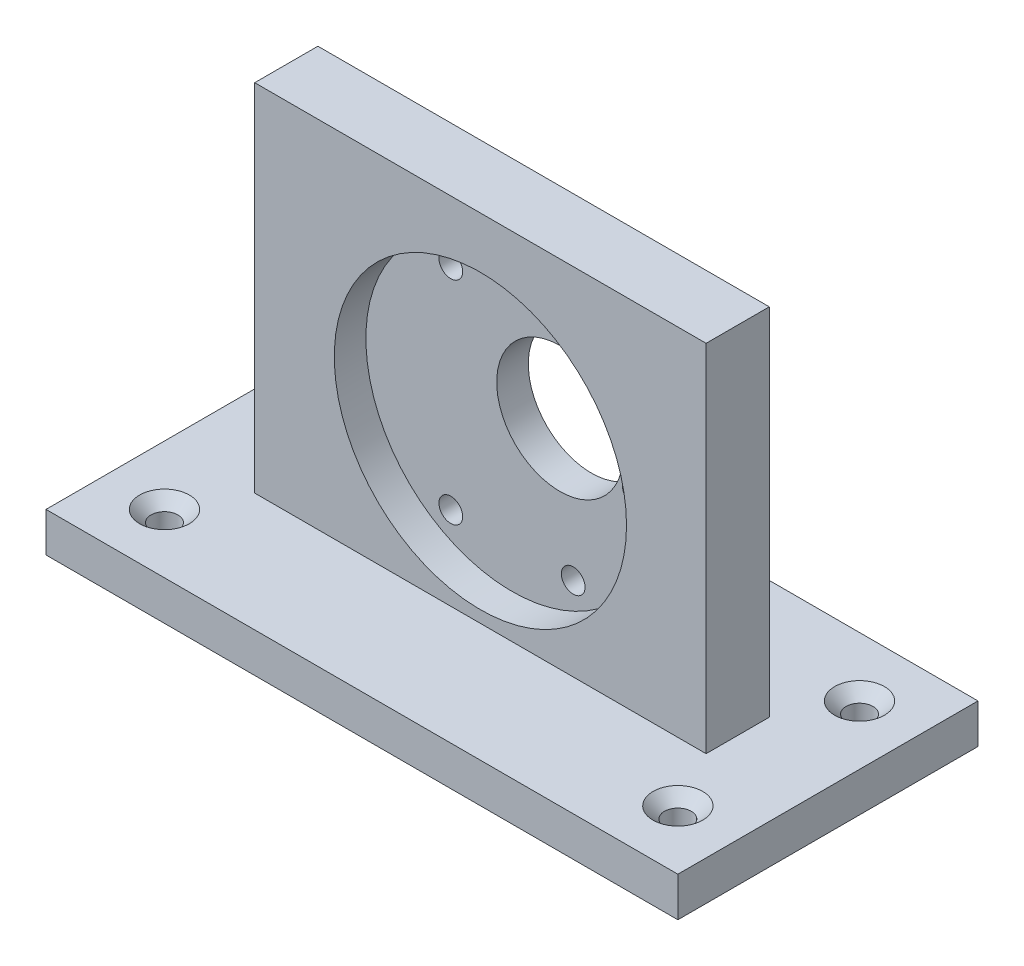
ISO-10303-21;
HEADER;
FILE_DESCRIPTION(('STEP AP214'),'2;1');
FILE_NAME('part.step','',(''),(''),'','','');
FILE_SCHEMA(('AUTOMOTIVE_DESIGN { 1 0 10303 214 1 1 1 1 }'));
ENDSEC;
DATA;
#1=APPLICATION_CONTEXT('core data for automotive mechanical design processes');
#2=APPLICATION_PROTOCOL_DEFINITION('international standard','automotive_design',2000,#1);
#3=PRODUCT_CONTEXT('',#1,'mechanical');
#4=PRODUCT('Part','Part','',(#3));
#5=PRODUCT_RELATED_PRODUCT_CATEGORY('part','',(#4));
#6=PRODUCT_DEFINITION_FORMATION('','',#4);
#7=PRODUCT_DEFINITION_CONTEXT('part definition',#1,'design');
#8=PRODUCT_DEFINITION('design','',#6,#7);
#9=PRODUCT_DEFINITION_SHAPE('','',#8);
#10=(LENGTH_UNIT() NAMED_UNIT(*) SI_UNIT(.MILLI.,.METRE.));
#11=(NAMED_UNIT(*) PLANE_ANGLE_UNIT() SI_UNIT($,.RADIAN.));
#12=(NAMED_UNIT(*) SI_UNIT($,.STERADIAN.) SOLID_ANGLE_UNIT());
#13=UNCERTAINTY_MEASURE_WITH_UNIT(LENGTH_MEASURE(1.E-05),#10,'distance_accuracy_value','');
#14=(GEOMETRIC_REPRESENTATION_CONTEXT(3) GLOBAL_UNCERTAINTY_ASSIGNED_CONTEXT((#13)) GLOBAL_UNIT_ASSIGNED_CONTEXT((#10,
#11,#12)) REPRESENTATION_CONTEXT('',''));
#15=CARTESIAN_POINT('',(0.,0.,0.));
#16=DIRECTION('',(0.,0.,1.));
#17=DIRECTION('',(1.,0.,0.));
#18=AXIS2_PLACEMENT_3D('',#15,#16,#17);
#19=CARTESIAN_POINT('',(-40.,5.,23.));
#20=DIRECTION('',(0.,-1.,0.));
#21=DIRECTION('',(1.,0.,0.));
#22=AXIS2_PLACEMENT_3D('',#19,#20,#21);
#23=PLANE('',#22);
#24=CARTESIAN_POINT('',(-32.5,5.,-7.5));
#25=DIRECTION('',(0.,1.,0.));
#26=DIRECTION('',(0.,0.,1.));
#27=AXIS2_PLACEMENT_3D('',#24,#25,#26);
#28=CIRCLE('',#27,3.15);
#29=CARTESIAN_POINT('',(-32.5,5.,-4.35));
#30=VERTEX_POINT('',#29);
#31=EDGE_CURVE('E156',#30,#30,#28,.T.);
#32=ORIENTED_EDGE('',*,*,#31,.F.);
#33=EDGE_LOOP('',(#32));
#34=FACE_BOUND('',#33,.T.);
#35=CARTESIAN_POINT('',(32.5,5.00000000000002,15.5));
#36=DIRECTION('',(0.,1.,0.));
#37=DIRECTION('',(0.,0.,1.));
#38=AXIS2_PLACEMENT_3D('',#35,#36,#37);
#39=CIRCLE('',#38,3.15);
#40=CARTESIAN_POINT('',(32.5,5.00000000000002,18.65));
#41=VERTEX_POINT('',#40);
#42=EDGE_CURVE('E166',#41,#41,#39,.T.);
#43=ORIENTED_EDGE('',*,*,#42,.F.);
#44=EDGE_LOOP('',(#43));
#45=FACE_BOUND('',#44,.T.);
#46=CARTESIAN_POINT('',(32.5,5.00000000000002,-7.5));
#47=DIRECTION('',(0.,1.,0.));
#48=DIRECTION('',(0.,0.,1.));
#49=AXIS2_PLACEMENT_3D('',#46,#47,#48);
#50=CIRCLE('',#49,3.15);
#51=CARTESIAN_POINT('',(32.5,5.00000000000002,-4.35));
#52=VERTEX_POINT('',#51);
#53=EDGE_CURVE('E178',#52,#52,#50,.T.);
#54=ORIENTED_EDGE('',*,*,#53,.F.);
#55=EDGE_LOOP('',(#54));
#56=FACE_BOUND('',#55,.T.);
#57=DIRECTION('',(0.,0.,-1.));
#58=VECTOR('',#57,1.);
#59=CARTESIAN_POINT('',(40.,5.00000000000002,23.));
#60=LINE('',#59,#58);
#61=CARTESIAN_POINT('',(40.,5.00000000000002,23.));
#62=VERTEX_POINT('',#61);
#63=CARTESIAN_POINT('',(40.,5.00000000000002,-15.));
#64=VERTEX_POINT('',#63);
#65=EDGE_CURVE('E222',#62,#64,#60,.T.);
#66=ORIENTED_EDGE('',*,*,#65,.T.);
#67=DIRECTION('',(-1.,0.,0.));
#68=VECTOR('',#67,1.);
#69=CARTESIAN_POINT('',(-40.,5.,-15.));
#70=LINE('',#69,#68);
#71=CARTESIAN_POINT('',(-40.,5.,-15.));
#72=VERTEX_POINT('',#71);
#73=EDGE_CURVE('E202',#64,#72,#70,.T.);
#74=ORIENTED_EDGE('',*,*,#73,.T.);
#75=DIRECTION('',(0.,0.,-1.));
#76=VECTOR('',#75,1.);
#77=CARTESIAN_POINT('',(-40.,5.,23.));
#78=LINE('',#77,#76);
#79=CARTESIAN_POINT('',(-40.,5.,23.));
#80=VERTEX_POINT('',#79);
#81=EDGE_CURVE('E219',#80,#72,#78,.T.);
#82=ORIENTED_EDGE('',*,*,#81,.F.);
#83=DIRECTION('',(-1.,0.,0.));
#84=VECTOR('',#83,1.);
#85=CARTESIAN_POINT('',(-40.,5.,23.));
#86=LINE('',#85,#84);
#87=EDGE_CURVE('E216',#62,#80,#86,.T.);
#88=ORIENTED_EDGE('',*,*,#87,.F.);
#89=EDGE_LOOP('',(#66,#74,#82,#88));
#90=FACE_BOUND('',#89,.T.);
#91=DIRECTION('',(0.,0.,-1.));
#92=VECTOR('',#91,1.);
#93=CARTESIAN_POINT('',(28.575,5.00000000000001,8.));
#94=LINE('',#93,#92);
#95=CARTESIAN_POINT('',(28.575,5.00000000000001,8.));
#96=VERTEX_POINT('',#95);
#97=CARTESIAN_POINT('',(28.575,5.00000000000001,0.));
#98=VERTEX_POINT('',#97);
#99=EDGE_CURVE('E231',#96,#98,#94,.T.);
#100=ORIENTED_EDGE('',*,*,#99,.F.);
#101=DIRECTION('',(-1.,0.,0.));
#102=VECTOR('',#101,1.);
#103=CARTESIAN_POINT('',(0.,5.00000000000001,8.));
#104=LINE('',#103,#102);
#105=CARTESIAN_POINT('',(-28.575,5.,8.));
#106=VERTEX_POINT('',#105);
#107=EDGE_CURVE('E238',#96,#106,#104,.T.);
#108=ORIENTED_EDGE('',*,*,#107,.T.);
#109=DIRECTION('',(0.,0.,-1.));
#110=VECTOR('',#109,1.);
#111=CARTESIAN_POINT('',(-28.575,5.,8.));
#112=LINE('',#111,#110);
#113=CARTESIAN_POINT('',(-28.575,5.,0.));
#114=VERTEX_POINT('',#113);
#115=EDGE_CURVE('E235',#106,#114,#112,.T.);
#116=ORIENTED_EDGE('',*,*,#115,.T.);
#117=DIRECTION('',(-1.,0.,0.));
#118=VECTOR('',#117,1.);
#119=CARTESIAN_POINT('',(0.,5.00000000000001,0.));
#120=LINE('',#119,#118);
#121=EDGE_CURVE('E60',#98,#114,#120,.T.);
#122=ORIENTED_EDGE('',*,*,#121,.F.);
#123=EDGE_LOOP('',(#100,#108,#116,#122));
#124=FACE_BOUND('',#123,.T.);
#125=CARTESIAN_POINT('',(-32.5,5.,15.5));
#126=DIRECTION('',(0.,1.,0.));
#127=DIRECTION('',(0.,0.,1.));
#128=AXIS2_PLACEMENT_3D('',#125,#126,#127);
#129=CIRCLE('',#128,3.15);
#130=CARTESIAN_POINT('',(-32.5,5.,18.65));
#131=VERTEX_POINT('',#130);
#132=EDGE_CURVE('E147',#131,#131,#129,.T.);
#133=ORIENTED_EDGE('',*,*,#132,.F.);
#134=EDGE_LOOP('',(#133));
#135=FACE_BOUND('',#134,.T.);
#136=ADVANCED_FACE('F51',(#34,#45,#56,#90,#124,#135),#23,.F.);
#137=CARTESIAN_POINT('',(-28.575,50.,8.));
#138=DIRECTION('',(1.,0.,0.));
#139=DIRECTION('',(0.,1.,0.));
#140=AXIS2_PLACEMENT_3D('',#137,#138,#139);
#141=PLANE('',#140);
#142=ORIENTED_EDGE('',*,*,#115,.F.);
#143=DIRECTION('',(0.,-1.,0.));
#144=VECTOR('',#143,1.);
#145=CARTESIAN_POINT('',(-28.575,50.,8.));
#146=LINE('',#145,#144);
#147=CARTESIAN_POINT('',(-28.575,50.,8.));
#148=VERTEX_POINT('',#147);
#149=EDGE_CURVE('E304',#148,#106,#146,.T.);
#150=ORIENTED_EDGE('',*,*,#149,.F.);
#151=DIRECTION('',(0.,0.,-1.));
#152=VECTOR('',#151,1.);
#153=CARTESIAN_POINT('',(-28.575,50.,8.));
#154=LINE('',#153,#152);
#155=CARTESIAN_POINT('',(-28.575,50.,0.));
#156=VERTEX_POINT('',#155);
#157=EDGE_CURVE('E319',#148,#156,#154,.T.);
#158=ORIENTED_EDGE('',*,*,#157,.T.);
#159=DIRECTION('',(0.,-1.,0.));
#160=VECTOR('',#159,1.);
#161=CARTESIAN_POINT('',(-28.575,50.,0.));
#162=LINE('',#161,#160);
#163=EDGE_CURVE('E300',#156,#114,#162,.T.);
#164=ORIENTED_EDGE('',*,*,#163,.T.);
#165=EDGE_LOOP('',(#142,#150,#158,#164));
#166=FACE_BOUND('',#165,.T.);
#167=ADVANCED_FACE('F336',(#166),#141,.F.);
#168=CARTESIAN_POINT('',(28.575,50.,8.));
#169=DIRECTION('',(1.,0.,0.));
#170=DIRECTION('',(0.,1.,0.));
#171=AXIS2_PLACEMENT_3D('',#168,#169,#170);
#172=PLANE('',#171);
#173=DIRECTION('',(0.,-1.,0.));
#174=VECTOR('',#173,1.);
#175=CARTESIAN_POINT('',(28.575,50.,8.));
#176=LINE('',#175,#174);
#177=CARTESIAN_POINT('',(28.575,50.,8.));
#178=VERTEX_POINT('',#177);
#179=EDGE_CURVE('E299',#178,#96,#176,.T.);
#180=ORIENTED_EDGE('',*,*,#179,.T.);
#181=ORIENTED_EDGE('',*,*,#99,.T.);
#182=DIRECTION('',(0.,-1.,0.));
#183=VECTOR('',#182,1.);
#184=CARTESIAN_POINT('',(28.575,50.,0.));
#185=LINE('',#184,#183);
#186=CARTESIAN_POINT('',(28.575,50.,0.));
#187=VERTEX_POINT('',#186);
#188=EDGE_CURVE('E312',#187,#98,#185,.T.);
#189=ORIENTED_EDGE('',*,*,#188,.F.);
#190=DIRECTION('',(0.,0.,-1.));
#191=VECTOR('',#190,1.);
#192=CARTESIAN_POINT('',(28.575,50.,8.));
#193=LINE('',#192,#191);
#194=EDGE_CURVE('E308',#178,#187,#193,.T.);
#195=ORIENTED_EDGE('',*,*,#194,.F.);
#196=EDGE_LOOP('',(#180,#181,#189,#195));
#197=FACE_BOUND('',#196,.T.);
#198=ADVANCED_FACE('F342',(#197),#172,.T.);
#199=CARTESIAN_POINT('',(0.,0.,8.));
#200=DIRECTION('',(0.,0.,-1.));
#201=DIRECTION('',(-1.,0.,0.));
#202=AXIS2_PLACEMENT_3D('',#199,#200,#201);
#203=PLANE('',#202);
#204=CARTESIAN_POINT('',(0.,25.,8.));
#205=DIRECTION('',(0.,0.,1.));
#206=DIRECTION('',(1.,0.,0.));
#207=AXIS2_PLACEMENT_3D('',#204,#205,#206);
#208=CIRCLE('',#207,18.5);
#209=CARTESIAN_POINT('',(18.5,25.,8.));
#210=VERTEX_POINT('',#209);
#211=EDGE_CURVE('E241',#210,#210,#208,.T.);
#212=ORIENTED_EDGE('',*,*,#211,.F.);
#213=EDGE_LOOP('',(#212));
#214=FACE_BOUND('',#213,.T.);
#215=ORIENTED_EDGE('',*,*,#107,.F.);
#216=ORIENTED_EDGE('',*,*,#179,.F.);
#217=DIRECTION('',(1.,0.,0.));
#218=VECTOR('',#217,1.);
#219=CARTESIAN_POINT('',(-28.575,50.,8.));
#220=LINE('',#219,#218);
#221=EDGE_CURVE('E295',#148,#178,#220,.T.);
#222=ORIENTED_EDGE('',*,*,#221,.F.);
#223=ORIENTED_EDGE('',*,*,#149,.T.);
#224=EDGE_LOOP('',(#215,#216,#222,#223));
#225=FACE_BOUND('',#224,.T.);
#226=ADVANCED_FACE('F346',(#214,#225),#203,.F.);
#227=CARTESIAN_POINT('',(0.,0.,0.));
#228=DIRECTION('',(0.,0.,-1.));
#229=DIRECTION('',(-1.,0.,0.));
#230=AXIS2_PLACEMENT_3D('',#227,#228,#229);
#231=PLANE('',#230);
#232=CARTESIAN_POINT('',(-20.3378221746704,28.4999999993294,0.));
#233=DIRECTION('',(0.,0.,-1.));
#234=DIRECTION('',(-1.,0.,0.));
#235=AXIS2_PLACEMENT_3D('',#232,#233,#234);
#236=CIRCLE('',#235,7.239);
#237=CARTESIAN_POINT('',(-27.5768221746704,28.4999999993294,0.));
#238=VERTEX_POINT('',#237);
#239=EDGE_CURVE('E763',#238,#238,#236,.T.);
#240=ORIENTED_EDGE('',*,*,#239,.F.);
#241=EDGE_LOOP('',(#240));
#242=FACE_BOUND('',#241,.T.);
#243=CARTESIAN_POINT('',(-7.74999999999999,38.4233937586588,0.));
#244=DIRECTION('',(0.,0.,1.));
#245=DIRECTION('',(1.,0.,0.));
#246=AXIS2_PLACEMENT_3D('',#243,#244,#245);
#247=CIRCLE('',#246,1.50000000039213);
#248=CARTESIAN_POINT('',(-6.24999999960786,38.4233937586588,0.));
#249=VERTEX_POINT('',#248);
#250=EDGE_CURVE('E275',#249,#249,#247,.T.);
#251=ORIENTED_EDGE('',*,*,#250,.T.);
#252=EDGE_LOOP('',(#251));
#253=FACE_BOUND('',#252,.T.);
#254=CARTESIAN_POINT('',(-7.74999999999999,11.5766062413412,0.));
#255=DIRECTION('',(0.,0.,1.));
#256=DIRECTION('',(1.,0.,0.));
#257=AXIS2_PLACEMENT_3D('',#254,#255,#256);
#258=CIRCLE('',#257,1.50000000039213);
#259=CARTESIAN_POINT('',(-6.24999999960786,11.5766062413412,0.));
#260=VERTEX_POINT('',#259);
#261=EDGE_CURVE('E280',#260,#260,#258,.T.);
#262=ORIENTED_EDGE('',*,*,#261,.T.);
#263=EDGE_LOOP('',(#262));
#264=FACE_BOUND('',#263,.T.);
#265=CARTESIAN_POINT('',(7.75000000000001,11.5766062413412,0.));
#266=DIRECTION('',(0.,0.,1.));
#267=DIRECTION('',(1.,0.,0.));
#268=AXIS2_PLACEMENT_3D('',#265,#266,#267);
#269=CIRCLE('',#268,1.50000000039213);
#270=CARTESIAN_POINT('',(9.25000000039214,11.5766062413412,0.));
#271=VERTEX_POINT('',#270);
#272=EDGE_CURVE('E284',#271,#271,#269,.T.);
#273=ORIENTED_EDGE('',*,*,#272,.T.);
#274=EDGE_LOOP('',(#273));
#275=FACE_BOUND('',#274,.T.);
#276=CARTESIAN_POINT('',(15.5,25.,0.));
#277=DIRECTION('',(0.,0.,1.));
#278=DIRECTION('',(1.,0.,0.));
#279=AXIS2_PLACEMENT_3D('',#276,#277,#278);
#280=CIRCLE('',#279,1.50000000039213);
#281=CARTESIAN_POINT('',(17.0000000003921,25.,0.));
#282=VERTEX_POINT('',#281);
#283=EDGE_CURVE('E274',#282,#282,#280,.T.);
#284=ORIENTED_EDGE('',*,*,#283,.T.);
#285=EDGE_LOOP('',(#284));
#286=FACE_BOUND('',#285,.T.);
#287=CARTESIAN_POINT('',(6.06217782532956,28.4999999993294,0.));
#288=DIRECTION('',(0.,0.,1.));
#289=DIRECTION('',(1.,0.,0.));
#290=AXIS2_PLACEMENT_3D('',#287,#288,#289);
#291=CIRCLE('',#290,8.00000000000001);
#292=CARTESIAN_POINT('',(14.0621778253296,28.4999999993294,0.));
#293=VERTEX_POINT('',#292);
#294=EDGE_CURVE('E270',#293,#293,#291,.T.);
#295=ORIENTED_EDGE('',*,*,#294,.T.);
#296=EDGE_LOOP('',(#295));
#297=FACE_BOUND('',#296,.T.);
#298=CARTESIAN_POINT('',(7.74999999999999,38.4233937586588,0.));
#299=DIRECTION('',(0.,0.,1.));
#300=DIRECTION('',(1.,0.,0.));
#301=AXIS2_PLACEMENT_3D('',#298,#299,#300);
#302=CIRCLE('',#301,1.50000000039214);
#303=CARTESIAN_POINT('',(9.25000000039213,38.4233937586588,0.));
#304=VERTEX_POINT('',#303);
#305=EDGE_CURVE('E279',#304,#304,#302,.T.);
#306=ORIENTED_EDGE('',*,*,#305,.T.);
#307=EDGE_LOOP('',(#306));
#308=FACE_BOUND('',#307,.T.);
#309=ORIENTED_EDGE('',*,*,#188,.T.);
#310=ORIENTED_EDGE('',*,*,#121,.T.);
#311=ORIENTED_EDGE('',*,*,#163,.F.);
#312=DIRECTION('',(1.,0.,0.));
#313=VECTOR('',#312,1.);
#314=CARTESIAN_POINT('',(-28.575,50.,0.));
#315=LINE('',#314,#313);
#316=EDGE_CURVE('E294',#156,#187,#315,.T.);
#317=ORIENTED_EDGE('',*,*,#316,.T.);
#318=EDGE_LOOP('',(#309,#310,#311,#317));
#319=FACE_BOUND('',#318,.T.);
#320=ADVANCED_FACE('F330',(#242,#253,#264,#275,#286,#297,#308,#319),#231,.T.);
#321=CARTESIAN_POINT('',(7.74999999999999,38.4233937586588,10.));
#322=DIRECTION('',(0.,0.,-1.));
#323=DIRECTION('',(-1.,0.,0.));
#324=AXIS2_PLACEMENT_3D('',#321,#322,#323);
#325=CYLINDRICAL_SURFACE('',#324,1.50000000039214);
#326=ORIENTED_EDGE('',*,*,#305,.F.);
#327=EDGE_LOOP('',(#326));
#328=FACE_BOUND('',#327,.T.);
#329=CARTESIAN_POINT('',(7.74999999999999,38.4233937586588,4.));
#330=DIRECTION('',(0.,0.,1.));
#331=DIRECTION('',(1.,0.,0.));
#332=AXIS2_PLACEMENT_3D('',#329,#330,#331);
#333=CIRCLE('',#332,1.50000000039214);
#334=CARTESIAN_POINT('',(9.25000000039213,38.4233937586588,4.));
#335=VERTEX_POINT('',#334);
#336=EDGE_CURVE('E266',#335,#335,#333,.T.);
#337=ORIENTED_EDGE('',*,*,#336,.T.);
#338=EDGE_LOOP('',(#337));
#339=FACE_BOUND('',#338,.T.);
#340=ADVANCED_FACE('F354',(#328,#339),#325,.F.);
#341=CARTESIAN_POINT('',(6.06217782532956,28.4999999993294,10.));
#342=DIRECTION('',(0.,0.,-1.));
#343=DIRECTION('',(-1.,0.,0.));
#344=AXIS2_PLACEMENT_3D('',#341,#342,#343);
#345=CYLINDRICAL_SURFACE('',#344,8.00000000000001);
#346=ORIENTED_EDGE('',*,*,#294,.F.);
#347=EDGE_LOOP('',(#346));
#348=FACE_BOUND('',#347,.T.);
#349=CARTESIAN_POINT('',(6.06217782532956,28.4999999993294,4.));
#350=DIRECTION('',(0.,0.,1.));
#351=DIRECTION('',(1.,0.,0.));
#352=AXIS2_PLACEMENT_3D('',#349,#350,#351);
#353=CIRCLE('',#352,8.00000000000001);
#354=CARTESIAN_POINT('',(14.0621778253296,28.4999999993294,4.));
#355=VERTEX_POINT('',#354);
#356=EDGE_CURVE('E262',#355,#355,#353,.T.);
#357=ORIENTED_EDGE('',*,*,#356,.T.);
#358=EDGE_LOOP('',(#357));
#359=FACE_BOUND('',#358,.T.);
#360=ADVANCED_FACE('F388',(#348,#359),#345,.F.);
#361=CARTESIAN_POINT('',(15.5,25.,10.));
#362=DIRECTION('',(0.,0.,-1.));
#363=DIRECTION('',(-1.,0.,0.));
#364=AXIS2_PLACEMENT_3D('',#361,#362,#363);
#365=CYLINDRICAL_SURFACE('',#364,1.50000000039213);
#366=ORIENTED_EDGE('',*,*,#283,.F.);
#367=EDGE_LOOP('',(#366));
#368=FACE_BOUND('',#367,.T.);
#369=CARTESIAN_POINT('',(15.5,25.,4.));
#370=DIRECTION('',(0.,0.,1.));
#371=DIRECTION('',(1.,0.,0.));
#372=AXIS2_PLACEMENT_3D('',#369,#370,#371);
#373=CIRCLE('',#372,1.50000000039213);
#374=CARTESIAN_POINT('',(17.0000000003921,25.,4.));
#375=VERTEX_POINT('',#374);
#376=EDGE_CURVE('E258',#375,#375,#373,.T.);
#377=ORIENTED_EDGE('',*,*,#376,.T.);
#378=EDGE_LOOP('',(#377));
#379=FACE_BOUND('',#378,.T.);
#380=ADVANCED_FACE('F391',(#368,#379),#365,.F.);
#381=CARTESIAN_POINT('',(7.75000000000001,11.5766062413412,10.));
#382=DIRECTION('',(0.,0.,-1.));
#383=DIRECTION('',(-1.,0.,0.));
#384=AXIS2_PLACEMENT_3D('',#381,#382,#383);
#385=CYLINDRICAL_SURFACE('',#384,1.50000000039213);
#386=ORIENTED_EDGE('',*,*,#272,.F.);
#387=EDGE_LOOP('',(#386));
#388=FACE_BOUND('',#387,.T.);
#389=CARTESIAN_POINT('',(7.75000000000001,11.5766062413412,4.));
#390=DIRECTION('',(0.,0.,1.));
#391=DIRECTION('',(1.,0.,0.));
#392=AXIS2_PLACEMENT_3D('',#389,#390,#391);
#393=CIRCLE('',#392,1.50000000039213);
#394=CARTESIAN_POINT('',(9.25000000039214,11.5766062413412,4.));
#395=VERTEX_POINT('',#394);
#396=EDGE_CURVE('E254',#395,#395,#393,.T.);
#397=ORIENTED_EDGE('',*,*,#396,.T.);
#398=EDGE_LOOP('',(#397));
#399=FACE_BOUND('',#398,.T.);
#400=ADVANCED_FACE('F400',(#388,#399),#385,.F.);
#401=CARTESIAN_POINT('',(-7.74999999999999,11.5766062413412,10.));
#402=DIRECTION('',(0.,0.,-1.));
#403=DIRECTION('',(-1.,0.,0.));
#404=AXIS2_PLACEMENT_3D('',#401,#402,#403);
#405=CYLINDRICAL_SURFACE('',#404,1.50000000039213);
#406=ORIENTED_EDGE('',*,*,#261,.F.);
#407=EDGE_LOOP('',(#406));
#408=FACE_BOUND('',#407,.T.);
#409=CARTESIAN_POINT('',(-7.74999999999999,11.5766062413412,4.));
#410=DIRECTION('',(0.,0.,1.));
#411=DIRECTION('',(1.,0.,0.));
#412=AXIS2_PLACEMENT_3D('',#409,#410,#411);
#413=CIRCLE('',#412,1.50000000039213);
#414=CARTESIAN_POINT('',(-6.24999999960786,11.5766062413412,4.));
#415=VERTEX_POINT('',#414);
#416=EDGE_CURVE('E250',#415,#415,#413,.T.);
#417=ORIENTED_EDGE('',*,*,#416,.T.);
#418=EDGE_LOOP('',(#417));
#419=FACE_BOUND('',#418,.T.);
#420=ADVANCED_FACE('F396',(#408,#419),#405,.F.);
#421=CARTESIAN_POINT('',(-7.74999999999999,38.4233937586588,10.));
#422=DIRECTION('',(0.,0.,-1.));
#423=DIRECTION('',(-1.,0.,0.));
#424=AXIS2_PLACEMENT_3D('',#421,#422,#423);
#425=CYLINDRICAL_SURFACE('',#424,1.50000000039213);
#426=ORIENTED_EDGE('',*,*,#250,.F.);
#427=EDGE_LOOP('',(#426));
#428=FACE_BOUND('',#427,.T.);
#429=CARTESIAN_POINT('',(-7.74999999999999,38.4233937586588,4.));
#430=DIRECTION('',(0.,0.,1.));
#431=DIRECTION('',(1.,0.,0.));
#432=AXIS2_PLACEMENT_3D('',#429,#430,#431);
#433=CIRCLE('',#432,1.50000000039213);
#434=CARTESIAN_POINT('',(-6.24999999960786,38.4233937586588,4.));
#435=VERTEX_POINT('',#434);
#436=EDGE_CURVE('E246',#435,#435,#433,.T.);
#437=ORIENTED_EDGE('',*,*,#436,.T.);
#438=EDGE_LOOP('',(#437));
#439=FACE_BOUND('',#438,.T.);
#440=ADVANCED_FACE('F393',(#428,#439),#425,.F.);
#441=CARTESIAN_POINT('',(-28.575,50.,8.));
#442=DIRECTION('',(0.,1.,0.));
#443=DIRECTION('',(-1.,0.,0.));
#444=AXIS2_PLACEMENT_3D('',#441,#442,#443);
#445=PLANE('',#444);
#446=ORIENTED_EDGE('',*,*,#316,.F.);
#447=ORIENTED_EDGE('',*,*,#157,.F.);
#448=ORIENTED_EDGE('',*,*,#221,.T.);
#449=ORIENTED_EDGE('',*,*,#194,.T.);
#450=EDGE_LOOP('',(#446,#447,#448,#449));
#451=FACE_BOUND('',#450,.T.);
#452=ADVANCED_FACE('F53',(#451),#445,.T.);
#453=CARTESIAN_POINT('',(0.,25.,4.));
#454=DIRECTION('',(0.,0.,1.));
#455=DIRECTION('',(1.,0.,0.));
#456=AXIS2_PLACEMENT_3D('',#453,#454,#455);
#457=CYLINDRICAL_SURFACE('',#456,18.5);
#458=CARTESIAN_POINT('',(0.,25.,4.));
#459=DIRECTION('',(0.,0.,1.));
#460=DIRECTION('',(1.,0.,0.));
#461=AXIS2_PLACEMENT_3D('',#458,#459,#460);
#462=CIRCLE('',#461,18.5);
#463=CARTESIAN_POINT('',(18.5,25.,4.));
#464=VERTEX_POINT('',#463);
#465=EDGE_CURVE('E242',#464,#464,#462,.T.);
#466=ORIENTED_EDGE('',*,*,#465,.F.);
#467=EDGE_LOOP('',(#466));
#468=FACE_BOUND('',#467,.T.);
#469=ORIENTED_EDGE('',*,*,#211,.T.);
#470=EDGE_LOOP('',(#469));
#471=FACE_BOUND('',#470,.T.);
#472=ADVANCED_FACE('F383',(#468,#471),#457,.F.);
#473=CARTESIAN_POINT('',(0.,25.,4.));
#474=DIRECTION('',(0.,0.,1.));
#475=DIRECTION('',(1.,0.,0.));
#476=AXIS2_PLACEMENT_3D('',#473,#474,#475);
#477=PLANE('',#476);
#478=ORIENTED_EDGE('',*,*,#336,.F.);
#479=EDGE_LOOP('',(#478));
#480=FACE_BOUND('',#479,.T.);
#481=ORIENTED_EDGE('',*,*,#356,.F.);
#482=EDGE_LOOP('',(#481));
#483=FACE_BOUND('',#482,.T.);
#484=ORIENTED_EDGE('',*,*,#376,.F.);
#485=EDGE_LOOP('',(#484));
#486=FACE_BOUND('',#485,.T.);
#487=ORIENTED_EDGE('',*,*,#396,.F.);
#488=EDGE_LOOP('',(#487));
#489=FACE_BOUND('',#488,.T.);
#490=ORIENTED_EDGE('',*,*,#416,.F.);
#491=EDGE_LOOP('',(#490));
#492=FACE_BOUND('',#491,.T.);
#493=ORIENTED_EDGE('',*,*,#436,.F.);
#494=EDGE_LOOP('',(#493));
#495=FACE_BOUND('',#494,.T.);
#496=ORIENTED_EDGE('',*,*,#465,.T.);
#497=EDGE_LOOP('',(#496));
#498=FACE_BOUND('',#497,.T.);
#499=ADVANCED_FACE('F379',(#480,#483,#486,#489,#492,#495,#498),#477,.T.);
#500=CARTESIAN_POINT('',(-40.,5.,23.));
#501=DIRECTION('',(1.,0.,0.));
#502=DIRECTION('',(0.,0.,-1.));
#503=AXIS2_PLACEMENT_3D('',#500,#501,#502);
#504=PLANE('',#503);
#505=ORIENTED_EDGE('',*,*,#81,.T.);
#506=DIRECTION('',(0.,-1.,0.));
#507=VECTOR('',#506,1.);
#508=CARTESIAN_POINT('',(-40.,5.,-15.));
#509=LINE('',#508,#507);
#510=CARTESIAN_POINT('',(-40.,0.,-15.));
#511=VERTEX_POINT('',#510);
#512=EDGE_CURVE('E190',#72,#511,#509,.T.);
#513=ORIENTED_EDGE('',*,*,#512,.T.);
#514=DIRECTION('',(0.,0.,-1.));
#515=VECTOR('',#514,1.);
#516=CARTESIAN_POINT('',(-40.,0.,23.));
#517=LINE('',#516,#515);
#518=CARTESIAN_POINT('',(-40.,0.,23.));
#519=VERTEX_POINT('',#518);
#520=EDGE_CURVE('E228',#519,#511,#517,.T.);
#521=ORIENTED_EDGE('',*,*,#520,.F.);
#522=DIRECTION('',(0.,-1.,0.));
#523=VECTOR('',#522,1.);
#524=CARTESIAN_POINT('',(-40.,5.,23.));
#525=LINE('',#524,#523);
#526=EDGE_CURVE('E206',#80,#519,#525,.T.);
#527=ORIENTED_EDGE('',*,*,#526,.F.);
#528=EDGE_LOOP('',(#505,#513,#521,#527));
#529=FACE_BOUND('',#528,.T.);
#530=ADVANCED_FACE('F375',(#529),#504,.F.);
#531=CARTESIAN_POINT('',(40.,5.00000000000002,23.));
#532=DIRECTION('',(-1.,0.,0.));
#533=DIRECTION('',(0.,0.,1.));
#534=AXIS2_PLACEMENT_3D('',#531,#532,#533);
#535=PLANE('',#534);
#536=DIRECTION('',(0.,0.,-1.));
#537=VECTOR('',#536,1.);
#538=CARTESIAN_POINT('',(40.,0.,23.));
#539=LINE('',#538,#537);
#540=CARTESIAN_POINT('',(40.,0.,23.));
#541=VERTEX_POINT('',#540);
#542=CARTESIAN_POINT('',(40.,0.,-15.));
#543=VERTEX_POINT('',#542);
#544=EDGE_CURVE('E225',#541,#543,#539,.T.);
#545=ORIENTED_EDGE('',*,*,#544,.T.);
#546=DIRECTION('',(0.,1.,0.));
#547=VECTOR('',#546,1.);
#548=CARTESIAN_POINT('',(40.,5.00000000000002,-15.));
#549=LINE('',#548,#547);
#550=EDGE_CURVE('E198',#543,#64,#549,.T.);
#551=ORIENTED_EDGE('',*,*,#550,.T.);
#552=ORIENTED_EDGE('',*,*,#65,.F.);
#553=DIRECTION('',(0.,1.,0.));
#554=VECTOR('',#553,1.);
#555=CARTESIAN_POINT('',(40.,5.00000000000002,23.));
#556=LINE('',#555,#554);
#557=EDGE_CURVE('E213',#541,#62,#556,.T.);
#558=ORIENTED_EDGE('',*,*,#557,.F.);
#559=EDGE_LOOP('',(#545,#551,#552,#558));
#560=FACE_BOUND('',#559,.T.);
#561=ADVANCED_FACE('F372',(#560),#535,.F.);
#562=CARTESIAN_POINT('',(0.,0.,23.));
#563=DIRECTION('',(0.,0.,1.));
#564=DIRECTION('',(1.,0.,0.));
#565=AXIS2_PLACEMENT_3D('',#562,#563,#564);
#566=PLANE('',#565);
#567=ORIENTED_EDGE('',*,*,#526,.T.);
#568=DIRECTION('',(1.,0.,0.));
#569=VECTOR('',#568,1.);
#570=CARTESIAN_POINT('',(-40.,0.,23.));
#571=LINE('',#570,#569);
#572=EDGE_CURVE('E210',#519,#541,#571,.T.);
#573=ORIENTED_EDGE('',*,*,#572,.T.);
#574=ORIENTED_EDGE('',*,*,#557,.T.);
#575=ORIENTED_EDGE('',*,*,#87,.T.);
#576=EDGE_LOOP('',(#567,#573,#574,#575));
#577=FACE_BOUND('',#576,.T.);
#578=ADVANCED_FACE('F370',(#577),#566,.T.);
#579=CARTESIAN_POINT('',(0.,0.,-15.));
#580=DIRECTION('',(0.,0.,1.));
#581=DIRECTION('',(1.,0.,0.));
#582=AXIS2_PLACEMENT_3D('',#579,#580,#581);
#583=PLANE('',#582);
#584=ORIENTED_EDGE('',*,*,#512,.F.);
#585=ORIENTED_EDGE('',*,*,#73,.F.);
#586=ORIENTED_EDGE('',*,*,#550,.F.);
#587=DIRECTION('',(1.,0.,0.));
#588=VECTOR('',#587,1.);
#589=CARTESIAN_POINT('',(-40.,0.,-15.));
#590=LINE('',#589,#588);
#591=EDGE_CURVE('E194',#511,#543,#590,.T.);
#592=ORIENTED_EDGE('',*,*,#591,.F.);
#593=EDGE_LOOP('',(#584,#585,#586,#592));
#594=FACE_BOUND('',#593,.T.);
#595=ADVANCED_FACE('F483',(#594),#583,.F.);
#596=CARTESIAN_POINT('',(-28.575,0.,8.));
#597=DIRECTION('',(0.,1.,0.));
#598=DIRECTION('',(-1.,0.,0.));
#599=AXIS2_PLACEMENT_3D('',#596,#597,#598);
#600=PLANE('',#599);
#601=CARTESIAN_POINT('',(-32.5,0.,-7.5));
#602=DIRECTION('',(0.,1.,0.));
#603=DIRECTION('',(0.,0.,1.));
#604=AXIS2_PLACEMENT_3D('',#601,#602,#603);
#605=CIRCLE('',#604,1.69999999999999);
#606=CARTESIAN_POINT('',(-32.9036495479958,0.,-5.8486166276716));
#607=VERTEX_POINT('',#606);
#608=CARTESIAN_POINT('',(-32.9870959921775,0.,-9.12872265730069));
#609=VERTEX_POINT('',#608);
#610=EDGE_CURVE('E140',#607,#609,#605,.T.);
#611=ORIENTED_EDGE('',*,*,#610,.T.);
#612=CARTESIAN_POINT('',(-33.3910360725576,0.,-7.47733189377985));
#613=DIRECTION('',(0.,1.,0.));
#614=DIRECTION('',(0.999676555950965,0.,-0.0254319382276978));
#615=AXIS2_PLACEMENT_3D('',#612,#613,#614);
#616=ELLIPSE('',#615,1.70110897002667,1.69999999999995);
#617=EDGE_CURVE('E134',#609,#607,#616,.T.);
#618=ORIENTED_EDGE('',*,*,#617,.T.);
#619=EDGE_LOOP('',(#611,#618));
#620=FACE_BOUND('',#619,.T.);
#621=CARTESIAN_POINT('',(-32.5,0.,15.5));
#622=DIRECTION('',(0.,1.,0.));
#623=DIRECTION('',(0.,0.,1.));
#624=AXIS2_PLACEMENT_3D('',#621,#622,#623);
#625=CIRCLE('',#624,1.69999999999999);
#626=CARTESIAN_POINT('',(-32.3175387253942,0.,17.1901798375526));
#627=VERTEX_POINT('',#626);
#628=CARTESIAN_POINT('',(-32.4037160435226,0.,13.8027288373024));
#629=VERTEX_POINT('',#628);
#630=EDGE_CURVE('E163',#627,#629,#625,.T.);
#631=ORIENTED_EDGE('',*,*,#630,.T.);
#632=EDGE_CURVE('E66',#629,#627,#625,.T.);
#633=ORIENTED_EDGE('',*,*,#632,.T.);
#634=EDGE_LOOP('',(#631,#633));
#635=FACE_BOUND('',#634,.T.);
#636=CARTESIAN_POINT('',(32.5,0.,15.5));
#637=DIRECTION('',(0.,1.,0.));
#638=DIRECTION('',(0.,0.,1.));
#639=AXIS2_PLACEMENT_3D('',#636,#637,#638);
#640=CIRCLE('',#639,1.69999999999999);
#641=CARTESIAN_POINT('',(32.5,0.,17.2));
#642=VERTEX_POINT('',#641);
#643=EDGE_CURVE('E174',#642,#642,#640,.T.);
#644=ORIENTED_EDGE('',*,*,#643,.T.);
#645=EDGE_LOOP('',(#644));
#646=FACE_BOUND('',#645,.T.);
#647=CARTESIAN_POINT('',(32.5,0.,-7.5));
#648=DIRECTION('',(0.,1.,0.));
#649=DIRECTION('',(0.,0.,1.));
#650=AXIS2_PLACEMENT_3D('',#647,#648,#649);
#651=CIRCLE('',#650,1.69999999999999);
#652=CARTESIAN_POINT('',(32.5,0.,-5.80000000000001));
#653=VERTEX_POINT('',#652);
#654=EDGE_CURVE('E186',#653,#653,#651,.T.);
#655=ORIENTED_EDGE('',*,*,#654,.T.);
#656=EDGE_LOOP('',(#655));
#657=FACE_BOUND('',#656,.T.);
#658=ORIENTED_EDGE('',*,*,#520,.T.);
#659=ORIENTED_EDGE('',*,*,#591,.T.);
#660=ORIENTED_EDGE('',*,*,#544,.F.);
#661=ORIENTED_EDGE('',*,*,#572,.F.);
#662=EDGE_LOOP('',(#658,#659,#660,#661));
#663=FACE_BOUND('',#662,.T.);
#664=ADVANCED_FACE('F139',(#620,#635,#646,#657,#663),#600,.F.);
#665=CARTESIAN_POINT('',(32.5,5.00000000000001,-7.5));
#666=DIRECTION('',(0.,1.,0.));
#667=DIRECTION('',(0.,0.,1.));
#668=AXIS2_PLACEMENT_3D('',#665,#666,#667);
#669=CYLINDRICAL_SURFACE('',#668,1.69999999999999);
#670=ORIENTED_EDGE('',*,*,#654,.F.);
#671=EDGE_LOOP('',(#670));
#672=FACE_BOUND('',#671,.T.);
#673=CARTESIAN_POINT('',(32.5,3.55000000000001,-7.5));
#674=DIRECTION('',(0.,1.,0.));
#675=DIRECTION('',(0.,0.,1.));
#676=AXIS2_PLACEMENT_3D('',#673,#674,#675);
#677=CIRCLE('',#676,1.69999999999999);
#678=CARTESIAN_POINT('',(32.5,3.55000000000001,-5.80000000000001));
#679=VERTEX_POINT('',#678);
#680=EDGE_CURVE('E182',#679,#679,#677,.T.);
#681=ORIENTED_EDGE('',*,*,#680,.T.);
#682=EDGE_LOOP('',(#681));
#683=FACE_BOUND('',#682,.T.);
#684=ADVANCED_FACE('F496',(#672,#683),#669,.F.);
#685=CARTESIAN_POINT('',(32.5,5.00000000000002,-7.5));
#686=DIRECTION('',(0.,1.,0.));
#687=DIRECTION('',(0.,0.,1.));
#688=AXIS2_PLACEMENT_3D('',#685,#686,#687);
#689=CONICAL_SURFACE('',#688,3.15,0.78539816339745);
#690=ORIENTED_EDGE('',*,*,#680,.F.);
#691=EDGE_LOOP('',(#690));
#692=FACE_BOUND('',#691,.T.);
#693=ORIENTED_EDGE('',*,*,#53,.T.);
#694=EDGE_LOOP('',(#693));
#695=FACE_BOUND('',#694,.T.);
#696=ADVANCED_FACE('F505',(#692,#695),#689,.F.);
#697=CARTESIAN_POINT('',(32.5,5.00000000000001,15.5));
#698=DIRECTION('',(0.,1.,0.));
#699=DIRECTION('',(0.,0.,1.));
#700=AXIS2_PLACEMENT_3D('',#697,#698,#699);
#701=CYLINDRICAL_SURFACE('',#700,1.69999999999999);
#702=ORIENTED_EDGE('',*,*,#643,.F.);
#703=EDGE_LOOP('',(#702));
#704=FACE_BOUND('',#703,.T.);
#705=CARTESIAN_POINT('',(32.5,3.55000000000001,15.5));
#706=DIRECTION('',(0.,1.,0.));
#707=DIRECTION('',(0.,0.,1.));
#708=AXIS2_PLACEMENT_3D('',#705,#706,#707);
#709=CIRCLE('',#708,1.69999999999999);
#710=CARTESIAN_POINT('',(32.5,3.55000000000001,17.2));
#711=VERTEX_POINT('',#710);
#712=EDGE_CURVE('E170',#711,#711,#709,.T.);
#713=ORIENTED_EDGE('',*,*,#712,.T.);
#714=EDGE_LOOP('',(#713));
#715=FACE_BOUND('',#714,.T.);
#716=ADVANCED_FACE('F513',(#704,#715),#701,.F.);
#717=CARTESIAN_POINT('',(32.5,5.00000000000002,15.5));
#718=DIRECTION('',(0.,1.,0.));
#719=DIRECTION('',(0.,0.,1.));
#720=AXIS2_PLACEMENT_3D('',#717,#718,#719);
#721=CONICAL_SURFACE('',#720,3.15,0.78539816339745);
#722=ORIENTED_EDGE('',*,*,#712,.F.);
#723=EDGE_LOOP('',(#722));
#724=FACE_BOUND('',#723,.T.);
#725=ORIENTED_EDGE('',*,*,#42,.T.);
#726=EDGE_LOOP('',(#725));
#727=FACE_BOUND('',#726,.T.);
#728=ADVANCED_FACE('F521',(#724,#727),#721,.F.);
#729=CARTESIAN_POINT('',(-32.5,5.,15.5));
#730=DIRECTION('',(0.,1.,0.));
#731=DIRECTION('',(0.,0.,1.));
#732=AXIS2_PLACEMENT_3D('',#729,#730,#731);
#733=CYLINDRICAL_SURFACE('',#732,1.69999999999999);
#734=ORIENTED_EDGE('',*,*,#630,.F.);
#735=ORIENTED_EDGE('',*,*,#632,.F.);
#736=EDGE_LOOP('',(#734,#735));
#737=FACE_BOUND('',#736,.T.);
#738=CARTESIAN_POINT('',(-32.5,3.54999999999999,15.5));
#739=DIRECTION('',(0.,1.,0.));
#740=DIRECTION('',(0.,0.,1.));
#741=AXIS2_PLACEMENT_3D('',#738,#739,#740);
#742=CIRCLE('',#741,1.69999999999999);
#743=CARTESIAN_POINT('',(-32.5,3.54999999999999,17.2));
#744=VERTEX_POINT('',#743);
#745=EDGE_CURVE('E153',#744,#744,#742,.T.);
#746=ORIENTED_EDGE('',*,*,#745,.T.);
#747=EDGE_LOOP('',(#746));
#748=FACE_BOUND('',#747,.T.);
#749=ADVANCED_FACE('F529',(#737,#748),#733,.F.);
#750=CARTESIAN_POINT('',(-32.5,5.,15.5));
#751=DIRECTION('',(0.,1.,0.));
#752=DIRECTION('',(0.,0.,1.));
#753=AXIS2_PLACEMENT_3D('',#750,#751,#752);
#754=CONICAL_SURFACE('',#753,3.15,0.78539816339745);
#755=ORIENTED_EDGE('',*,*,#745,.F.);
#756=EDGE_LOOP('',(#755));
#757=FACE_BOUND('',#756,.T.);
#758=ORIENTED_EDGE('',*,*,#132,.T.);
#759=EDGE_LOOP('',(#758));
#760=FACE_BOUND('',#759,.T.);
#761=ADVANCED_FACE('F537',(#757,#760),#754,.F.);
#762=CARTESIAN_POINT('',(-32.5,5.,-7.5));
#763=DIRECTION('',(0.,1.,0.));
#764=DIRECTION('',(0.,0.,1.));
#765=AXIS2_PLACEMENT_3D('',#762,#763,#764);
#766=CYLINDRICAL_SURFACE('',#765,1.69999999999999);
#767=ORIENTED_EDGE('',*,*,#610,.F.);
#768=CARTESIAN_POINT('',(-32.5,-0.016094793527521,-7.5));
#769=DIRECTION('',(0.0360908865319122,0.999348089954104,-0.000918158169658495));
#770=DIRECTION('',(-0.999024856761494,0.036102563691293,0.0254153588916807));
#771=AXIS2_PLACEMENT_3D('',#768,#769,#770);
#772=ELLIPSE('',#771,1.70110897002671,1.69999999999999);
#773=EDGE_CURVE('E12',#607,#609,#772,.F.);
#774=ORIENTED_EDGE('',*,*,#773,.T.);
#775=EDGE_LOOP('',(#767,#774));
#776=FACE_BOUND('',#775,.T.);
#777=CARTESIAN_POINT('',(-32.5,3.54999999999999,-7.5));
#778=DIRECTION('',(0.,1.,0.));
#779=DIRECTION('',(0.,0.,1.));
#780=AXIS2_PLACEMENT_3D('',#777,#778,#779);
#781=CIRCLE('',#780,1.69999999999999);
#782=CARTESIAN_POINT('',(-32.5,3.54999999999999,-5.80000000000001));
#783=VERTEX_POINT('',#782);
#784=EDGE_CURVE('E148',#783,#783,#781,.T.);
#785=ORIENTED_EDGE('',*,*,#784,.T.);
#786=EDGE_LOOP('',(#785));
#787=FACE_BOUND('',#786,.T.);
#788=ADVANCED_FACE('F144',(#776,#787),#766,.F.);
#789=CARTESIAN_POINT('',(-32.5,5.,-7.5));
#790=DIRECTION('',(0.,1.,0.));
#791=DIRECTION('',(0.,0.,1.));
#792=AXIS2_PLACEMENT_3D('',#789,#790,#791);
#793=CONICAL_SURFACE('',#792,3.15,0.78539816339745);
#794=ORIENTED_EDGE('',*,*,#784,.F.);
#795=EDGE_LOOP('',(#794));
#796=FACE_BOUND('',#795,.T.);
#797=ORIENTED_EDGE('',*,*,#31,.T.);
#798=EDGE_LOOP('',(#797));
#799=FACE_BOUND('',#798,.T.);
#800=ADVANCED_FACE('F551',(#796,#799),#793,.F.);
#801=CARTESIAN_POINT('',(-20.3378221746704,28.4999999993294,-2.54));
#802=DIRECTION('',(0.,0.,-1.));
#803=DIRECTION('',(-1.,0.,0.));
#804=AXIS2_PLACEMENT_3D('',#801,#802,#803);
#805=PLANE('',#804);
#806=CARTESIAN_POINT('',(-20.3378221746704,28.4999999993294,-2.54));
#807=DIRECTION('',(0.,0.,-1.));
#808=DIRECTION('',(-1.,0.,0.));
#809=AXIS2_PLACEMENT_3D('',#806,#807,#808);
#810=CIRCLE('',#809,7.239);
#811=CARTESIAN_POINT('',(-27.5768221746704,28.4999999993294,-2.54));
#812=VERTEX_POINT('',#811);
#813=EDGE_CURVE('E764',#812,#812,#810,.T.);
#814=ORIENTED_EDGE('',*,*,#813,.T.);
#815=EDGE_LOOP('',(#814));
#816=FACE_BOUND('',#815,.T.);
#817=CARTESIAN_POINT('',(-20.3378221746704,28.4999999993294,-2.54));
#818=DIRECTION('',(0.,0.,-1.));
#819=DIRECTION('',(-1.,0.,0.));
#820=AXIS2_PLACEMENT_3D('',#817,#818,#819);
#821=CIRCLE('',#820,5.334);
#822=CARTESIAN_POINT('',(-25.6718221746704,28.4999999993294,-2.54));
#823=VERTEX_POINT('',#822);
#824=EDGE_CURVE('E142',#823,#823,#821,.T.);
#825=ORIENTED_EDGE('',*,*,#824,.F.);
#826=EDGE_LOOP('',(#825));
#827=FACE_BOUND('',#826,.T.);
#828=ADVANCED_FACE('F558',(#816,#827),#805,.T.);
#829=CARTESIAN_POINT('',(-20.3378221746704,28.4999999993294,-2.54));
#830=DIRECTION('',(0.,0.,1.));
#831=DIRECTION('',(1.,0.,0.));
#832=AXIS2_PLACEMENT_3D('',#829,#830,#831);
#833=CYLINDRICAL_SURFACE('',#832,7.239);
#834=ORIENTED_EDGE('',*,*,#813,.F.);
#835=EDGE_LOOP('',(#834));
#836=FACE_BOUND('',#835,.T.);
#837=ORIENTED_EDGE('',*,*,#239,.T.);
#838=EDGE_LOOP('',(#837));
#839=FACE_BOUND('',#838,.T.);
#840=ADVANCED_FACE('F566',(#836,#839),#833,.T.);
#841=CARTESIAN_POINT('',(-20.3378221746704,28.4999999993294,-2.54));
#842=DIRECTION('',(0.,0.,1.));
#843=DIRECTION('',(1.,0.,0.));
#844=AXIS2_PLACEMENT_3D('',#841,#842,#843);
#845=CYLINDRICAL_SURFACE('',#844,5.334);
#846=ORIENTED_EDGE('',*,*,#824,.T.);
#847=EDGE_LOOP('',(#846));
#848=FACE_BOUND('',#847,.T.);
#849=CARTESIAN_POINT('',(-20.3378221746704,28.4999999993294,3.175));
#850=DIRECTION('',(0.,0.,-1.));
#851=DIRECTION('',(-1.,0.,0.));
#852=AXIS2_PLACEMENT_3D('',#849,#850,#851);
#853=CIRCLE('',#852,5.334);
#854=CARTESIAN_POINT('',(-25.6718221746704,28.4999999993294,3.175));
#855=VERTEX_POINT('',#854);
#856=EDGE_CURVE('E136',#855,#855,#853,.T.);
#857=ORIENTED_EDGE('',*,*,#856,.F.);
#858=EDGE_LOOP('',(#857));
#859=FACE_BOUND('',#858,.T.);
#860=ADVANCED_FACE('F573',(#848,#859),#845,.F.);
#861=CARTESIAN_POINT('',(-33.7483746119551,-9.89461942138965,-7.46824114176988));
#862=DIRECTION('',(0.0360908865319122,0.999348089954104,-0.000918158169658495));
#863=DIRECTION('',(-0.999348511186798,0.0360909017444907,0.));
#864=AXIS2_PLACEMENT_3D('',#861,#862,#863);
#865=CYLINDRICAL_SURFACE('',#864,1.69999999999995);
#866=CARTESIAN_POINT('',(-33.3904551971907,0.0160843011699149,-7.47734667134602));
#867=DIRECTION('',(0.0360908865319122,0.999348089954104,-0.000918158169658495));
#868=DIRECTION('',(-0.999348511186798,0.0360909017444907,0.));
#869=AXIS2_PLACEMENT_3D('',#866,#867,#868);
#870=CIRCLE('',#869,1.69999999999995);
#871=EDGE_CURVE('E126',#609,#607,#870,.T.);
#872=ORIENTED_EDGE('',*,*,#871,.T.);
#873=ORIENTED_EDGE('',*,*,#617,.F.);
#874=EDGE_LOOP('',(#872,#873));
#875=FACE_BOUND('',#874,.T.);
#876=ADVANCED_FACE('F133',(#875),#865,.F.);
#877=CARTESIAN_POINT('',(-33.3904551971907,0.0160843011699149,-7.47734667134602));
#878=DIRECTION('',(0.0360908865319122,0.999348089954104,-0.000918158169658495));
#879=DIRECTION('',(-0.999348511186798,0.0360909017444907,0.));
#880=AXIS2_PLACEMENT_3D('',#877,#878,#879);
#881=PLANE('',#880);
#882=ORIENTED_EDGE('',*,*,#871,.F.);
#883=ORIENTED_EDGE('',*,*,#773,.F.);
#884=EDGE_LOOP('',(#882,#883));
#885=FACE_BOUND('',#884,.T.);
#886=ADVANCED_FACE('F125',(#885),#881,.F.);
#887=CARTESIAN_POINT('',(0.,0.,3.175));
#888=DIRECTION('',(0.,0.,-1.));
#889=DIRECTION('',(-1.,0.,0.));
#890=AXIS2_PLACEMENT_3D('',#887,#888,#889);
#891=PLANE('',#890);
#892=ORIENTED_EDGE('',*,*,#856,.T.);
#893=EDGE_LOOP('',(#892));
#894=FACE_BOUND('',#893,.T.);
#895=ADVANCED_FACE('F594',(#894),#891,.T.);
#896=CLOSED_SHELL('',(#136,#167,#198,#226,#320,#340,#360,#380,#400,#420,#440,#452,#472,#499,
#530,#561,#578,#595,#664,#684,#696,#716,#728,#749,#761,#788,#800,#828,#840,#860,#876,#886,#895));
#897=MANIFOLD_SOLID_BREP('B2',#896);
#898=ADVANCED_BREP_SHAPE_REPRESENTATION('',(#18,#897),#14);
#899=SHAPE_DEFINITION_REPRESENTATION(#9,#898);
ENDSEC;
END-ISO-10303-21;
